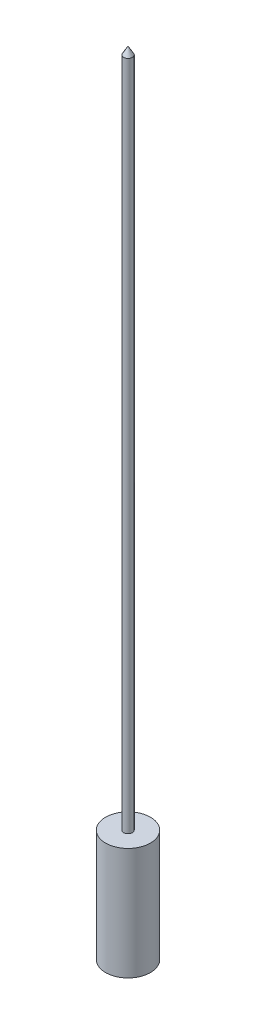
ISO-10303-21;
HEADER;
FILE_DESCRIPTION(('STEP AP214'),'2;1');
FILE_NAME('part.step','',(''),(''),'','','');
FILE_SCHEMA(('AUTOMOTIVE_DESIGN { 1 0 10303 214 1 1 1 1 }'));
ENDSEC;
DATA;
#1=APPLICATION_CONTEXT('core data for automotive mechanical design processes');
#2=APPLICATION_PROTOCOL_DEFINITION('international standard','automotive_design',2000,#1);
#3=PRODUCT_CONTEXT('',#1,'mechanical');
#4=PRODUCT('Part','Part','',(#3));
#5=PRODUCT_RELATED_PRODUCT_CATEGORY('part','',(#4));
#6=PRODUCT_DEFINITION_FORMATION('','',#4);
#7=PRODUCT_DEFINITION_CONTEXT('part definition',#1,'design');
#8=PRODUCT_DEFINITION('design','',#6,#7);
#9=PRODUCT_DEFINITION_SHAPE('','',#8);
#10=(LENGTH_UNIT() NAMED_UNIT(*) SI_UNIT(.MILLI.,.METRE.));
#11=(NAMED_UNIT(*) PLANE_ANGLE_UNIT() SI_UNIT($,.RADIAN.));
#12=(NAMED_UNIT(*) SI_UNIT($,.STERADIAN.) SOLID_ANGLE_UNIT());
#13=UNCERTAINTY_MEASURE_WITH_UNIT(LENGTH_MEASURE(1.E-05),#10,'distance_accuracy_value','');
#14=(GEOMETRIC_REPRESENTATION_CONTEXT(3) GLOBAL_UNCERTAINTY_ASSIGNED_CONTEXT((#13)) GLOBAL_UNIT_ASSIGNED_CONTEXT((#10,
#11,#12)) REPRESENTATION_CONTEXT('',''));
#15=CARTESIAN_POINT('',(0.,0.,0.));
#16=DIRECTION('',(0.,0.,1.));
#17=DIRECTION('',(1.,0.,0.));
#18=AXIS2_PLACEMENT_3D('',#15,#16,#17);
#19=CARTESIAN_POINT('',(0.,0.,0.));
#20=DIRECTION('',(0.,-1.,0.));
#21=DIRECTION('',(0.,0.,-1.));
#22=AXIS2_PLACEMENT_3D('',#19,#20,#21);
#23=CYLINDRICAL_SURFACE('',#22,0.5);
#24=CARTESIAN_POINT('',(0.,76.000000146,0.));
#25=DIRECTION('',(0.,-1.,0.));
#26=DIRECTION('',(0.,0.,-1.));
#27=AXIS2_PLACEMENT_3D('',#24,#25,#26);
#28=CIRCLE('',#27,0.5);
#29=CARTESIAN_POINT('',(0.,76.000000146,-0.5));
#30=VERTEX_POINT('',#29);
#31=EDGE_CURVE('E11',#30,#30,#28,.T.);
#32=ORIENTED_EDGE('',*,*,#31,.T.);
#33=EDGE_LOOP('',(#32));
#34=FACE_BOUND('',#33,.T.);
#35=CARTESIAN_POINT('',(0.,0.,0.));
#36=DIRECTION('',(0.,-1.,0.));
#37=DIRECTION('',(0.,0.,-1.));
#38=AXIS2_PLACEMENT_3D('',#35,#36,#37);
#39=CIRCLE('',#38,0.5);
#40=CARTESIAN_POINT('',(0.,0.,-0.5));
#41=VERTEX_POINT('',#40);
#42=EDGE_CURVE('E48',#41,#41,#39,.T.);
#43=ORIENTED_EDGE('',*,*,#42,.F.);
#44=EDGE_LOOP('',(#43));
#45=FACE_BOUND('',#44,.T.);
#46=ADVANCED_FACE('F41',(#34,#45),#23,.T.);
#47=CARTESIAN_POINT('',(0.,76.8660255497844,0.));
#48=DIRECTION('',(0.,-1.,0.));
#49=DIRECTION('',(0.,0.,-1.));
#50=AXIS2_PLACEMENT_3D('',#47,#48,#49);
#51=CONICAL_SURFACE('',#50,0.,0.523598775598297);
#52=ORIENTED_EDGE('',*,*,#31,.F.);
#53=EDGE_LOOP('',(#52));
#54=FACE_BOUND('',#53,.T.);
#55=CARTESIAN_POINT('',(0.,76.8660255497844,0.));
#56=VERTEX_POINT('',#55);
#57=VERTEX_LOOP('',#56);
#58=FACE_BOUND('',#57,.T.);
#59=ADVANCED_FACE('F51',(#54,#58),#51,.T.);
#60=CARTESIAN_POINT('',(0.,-12.7,0.));
#61=DIRECTION('',(0.,1.,0.));
#62=DIRECTION('',(0.,0.,1.));
#63=AXIS2_PLACEMENT_3D('',#60,#61,#62);
#64=CYLINDRICAL_SURFACE('',#63,2.54);
#65=CARTESIAN_POINT('',(0.,-12.7,0.));
#66=DIRECTION('',(0.,-1.,0.));
#67=DIRECTION('',(0.,0.,-1.));
#68=AXIS2_PLACEMENT_3D('',#65,#66,#67);
#69=CIRCLE('',#68,2.54);
#70=CARTESIAN_POINT('',(0.,-12.7,-2.54));
#71=VERTEX_POINT('',#70);
#72=EDGE_CURVE('E75',#71,#71,#69,.T.);
#73=ORIENTED_EDGE('',*,*,#72,.F.);
#74=EDGE_LOOP('',(#73));
#75=FACE_BOUND('',#74,.T.);
#76=CARTESIAN_POINT('',(0.,0.,0.));
#77=DIRECTION('',(0.,-1.,0.));
#78=DIRECTION('',(0.,0.,-1.));
#79=AXIS2_PLACEMENT_3D('',#76,#77,#78);
#80=CIRCLE('',#79,2.54);
#81=CARTESIAN_POINT('',(0.,0.,-2.54));
#82=VERTEX_POINT('',#81);
#83=EDGE_CURVE('E77',#82,#82,#80,.T.);
#84=ORIENTED_EDGE('',*,*,#83,.T.);
#85=EDGE_LOOP('',(#84));
#86=FACE_BOUND('',#85,.T.);
#87=ADVANCED_FACE('F53',(#75,#86),#64,.T.);
#88=CARTESIAN_POINT('',(0.,-12.7,0.));
#89=DIRECTION('',(0.,-1.,0.));
#90=DIRECTION('',(0.,0.,-1.));
#91=AXIS2_PLACEMENT_3D('',#88,#89,#90);
#92=PLANE('',#91);
#93=ORIENTED_EDGE('',*,*,#72,.T.);
#94=EDGE_LOOP('',(#93));
#95=FACE_BOUND('',#94,.T.);
#96=ADVANCED_FACE('F59',(#95),#92,.T.);
#97=CARTESIAN_POINT('',(0.,0.,0.));
#98=DIRECTION('',(0.,-1.,0.));
#99=DIRECTION('',(0.,0.,-1.));
#100=AXIS2_PLACEMENT_3D('',#97,#98,#99);
#101=PLANE('',#100);
#102=ORIENTED_EDGE('',*,*,#42,.T.);
#103=EDGE_LOOP('',(#102));
#104=FACE_BOUND('',#103,.T.);
#105=ORIENTED_EDGE('',*,*,#83,.F.);
#106=EDGE_LOOP('',(#105));
#107=FACE_BOUND('',#106,.T.);
#108=ADVANCED_FACE('F65',(#104,#107),#101,.F.);
#109=CLOSED_SHELL('',(#46,#59,#87,#96,#108));
#110=MANIFOLD_SOLID_BREP('B2',#109);
#111=ADVANCED_BREP_SHAPE_REPRESENTATION('',(#18,#110),#14);
#112=SHAPE_DEFINITION_REPRESENTATION(#9,#111);
ENDSEC;
END-ISO-10303-21;
